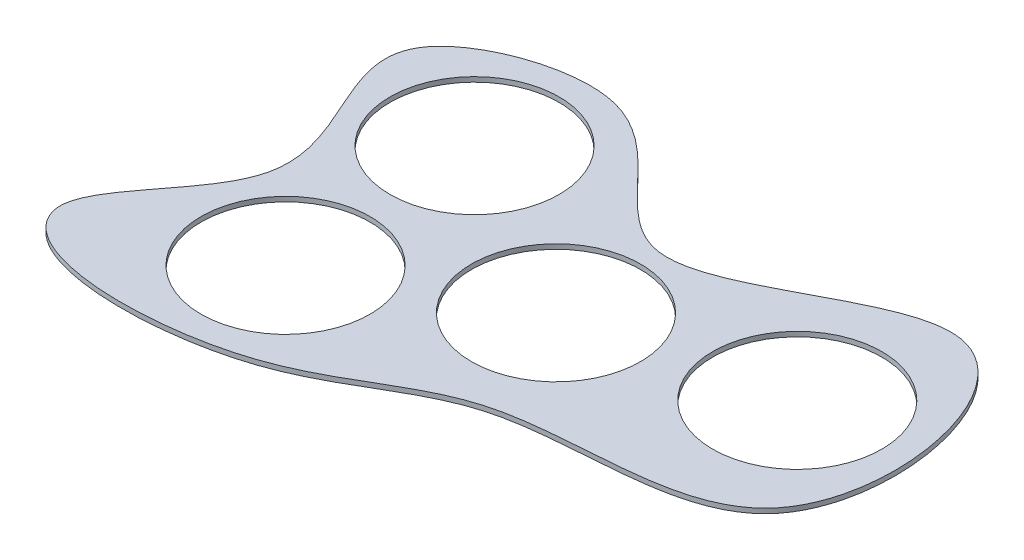
ISO-10303-21;
HEADER;
FILE_DESCRIPTION(('STEP AP214'),'2;1');
FILE_NAME('part.step','',(''),(''),'','','');
FILE_SCHEMA(('AUTOMOTIVE_DESIGN { 1 0 10303 214 1 1 1 1 }'));
ENDSEC;
DATA;
#1=APPLICATION_CONTEXT('core data for automotive mechanical design processes');
#2=APPLICATION_PROTOCOL_DEFINITION('international standard','automotive_design',2000,#1);
#3=PRODUCT_CONTEXT('',#1,'mechanical');
#4=PRODUCT('Part','Part','',(#3));
#5=PRODUCT_RELATED_PRODUCT_CATEGORY('part','',(#4));
#6=PRODUCT_DEFINITION_FORMATION('','',#4);
#7=PRODUCT_DEFINITION_CONTEXT('part definition',#1,'design');
#8=PRODUCT_DEFINITION('design','',#6,#7);
#9=PRODUCT_DEFINITION_SHAPE('','',#8);
#10=(LENGTH_UNIT() NAMED_UNIT(*) SI_UNIT(.MILLI.,.METRE.));
#11=(NAMED_UNIT(*) PLANE_ANGLE_UNIT() SI_UNIT($,.RADIAN.));
#12=(NAMED_UNIT(*) SI_UNIT($,.STERADIAN.) SOLID_ANGLE_UNIT());
#13=UNCERTAINTY_MEASURE_WITH_UNIT(LENGTH_MEASURE(1.E-05),#10,'distance_accuracy_value','');
#14=(GEOMETRIC_REPRESENTATION_CONTEXT(3) GLOBAL_UNCERTAINTY_ASSIGNED_CONTEXT((#13)) GLOBAL_UNIT_ASSIGNED_CONTEXT((#10,
#11,#12)) REPRESENTATION_CONTEXT('',''));
#15=CARTESIAN_POINT('',(0.,0.,0.));
#16=DIRECTION('',(0.,0.,1.));
#17=DIRECTION('',(1.,0.,0.));
#18=AXIS2_PLACEMENT_3D('',#15,#16,#17);
#19=CARTESIAN_POINT('',(376.308298772979,3.175,-277.585767369261));
#20=DIRECTION('',(0.,1.,0.));
#21=DIRECTION('',(0.,0.,1.));
#22=AXIS2_PLACEMENT_3D('',#19,#20,#21);
#23=PLANE('',#22);
#24=CARTESIAN_POINT('',(108.537567991192,3.175,-97.0398034103113));
#25=DIRECTION('',(0.,1.,0.));
#26=DIRECTION('',(0.,0.,1.));
#27=AXIS2_PLACEMENT_3D('',#24,#25,#26);
#28=CIRCLE('',#27,55.88);
#29=CARTESIAN_POINT('',(108.537567991192,3.175,-41.1598034103113));
#30=VERTEX_POINT('',#29);
#31=EDGE_CURVE('E63',#30,#30,#28,.T.);
#32=ORIENTED_EDGE('',*,*,#31,.F.);
#33=EDGE_LOOP('',(#32));
#34=FACE_BOUND('',#33,.T.);
#35=CARTESIAN_POINT('',(102.486134684682,3.175,-227.958678444939));
#36=DIRECTION('',(0.,1.,0.));
#37=DIRECTION('',(0.,0.,1.));
#38=AXIS2_PLACEMENT_3D('',#35,#36,#37);
#39=CIRCLE('',#38,55.88);
#40=CARTESIAN_POINT('',(102.486134684682,3.175,-172.078678444939));
#41=VERTEX_POINT('',#40);
#42=EDGE_CURVE('E46',#41,#41,#39,.T.);
#43=ORIENTED_EDGE('',*,*,#42,.F.);
#44=EDGE_LOOP('',(#43));
#45=FACE_BOUND('',#44,.T.);
#46=CARTESIAN_POINT('',(0.,3.175,-56.6444709200918));
#47=CARTESIAN_POINT('',(0.0126566039944185,3.175,-52.7630468766074));
#48=CARTESIAN_POINT('',(10.9143487990168,3.175,-15.8724778771619));
#49=CARTESIAN_POINT('',(163.766720812988,3.175,-15.8407560526298));
#50=CARTESIAN_POINT('',(250.715074531987,3.175,-106.079695571234));
#51=CARTESIAN_POINT('',(462.64127847462,3.175,-68.1597945949002));
#52=CARTESIAN_POINT('',(409.016180274923,3.175,-359.180610617191));
#53=CARTESIAN_POINT('',(209.806238473112,3.175,-169.252495944739));
#54=CARTESIAN_POINT('',(153.72950032436,3.175,-329.972611971777));
#55=CARTESIAN_POINT('',(-29.0455630594548,3.175,-261.573495278705));
#56=CARTESIAN_POINT('',(99.4877551865543,3.175,-156.747058417687));
#57=CARTESIAN_POINT('',(-0.0778541964517009,3.175,-80.5201606491206));
#58=CARTESIAN_POINT('',(0.,3.175,-56.6444709200918));
#59=B_SPLINE_CURVE_WITH_KNOTS('',3,(#46,#47,#48,#49,#50,#51,#52,#53,#54,#55,#56,#57,#58),
.UNSPECIFIED.,.T.,.F.,(4,1,1,1,1,1,1,1,1,1,4),(0.,0.0132885350104652,0.132885350104652,
0.229370198323285,0.35653493227593,0.505081347888579,0.620871775024687,0.725448929490409,
0.800000292431165,0.918258624847806,1.),.UNSPECIFIED.);
#60=CARTESIAN_POINT('',(0.,3.175,-56.6444709200918));
#61=VERTEX_POINT('',#60);
#62=EDGE_CURVE('E10',#61,#61,#59,.T.);
#63=ORIENTED_EDGE('',*,*,#62,.T.);
#64=EDGE_LOOP('',(#63));
#65=FACE_BOUND('',#64,.T.);
#66=CARTESIAN_POINT('',(225.036303489623,3.175,-159.227707713015));
#67=DIRECTION('',(0.,1.,0.));
#68=DIRECTION('',(0.,0.,1.));
#69=AXIS2_PLACEMENT_3D('',#66,#67,#68);
#70=CIRCLE('',#69,55.88);
#71=CARTESIAN_POINT('',(225.036303489623,3.175,-103.347707713015));
#72=VERTEX_POINT('',#71);
#73=EDGE_CURVE('E57',#72,#72,#70,.T.);
#74=ORIENTED_EDGE('',*,*,#73,.F.);
#75=EDGE_LOOP('',(#74));
#76=FACE_BOUND('',#75,.T.);
#77=CARTESIAN_POINT('',(354.832588956363,3.175,-188.836057118934));
#78=DIRECTION('',(0.,1.,0.));
#79=DIRECTION('',(0.,0.,1.));
#80=AXIS2_PLACEMENT_3D('',#77,#78,#79);
#81=CIRCLE('',#80,55.88);
#82=CARTESIAN_POINT('',(354.832588956363,3.175,-132.956057118934));
#83=VERTEX_POINT('',#82);
#84=EDGE_CURVE('E69',#83,#83,#81,.T.);
#85=ORIENTED_EDGE('',*,*,#84,.F.);
#86=EDGE_LOOP('',(#85));
#87=FACE_BOUND('',#86,.T.);
#88=ADVANCED_FACE('F33',(#34,#45,#65,#76,#87),#23,.T.);
#89=CARTESIAN_POINT('',(376.308298772979,0.,-277.585767369261));
#90=DIRECTION('',(0.,1.,0.));
#91=DIRECTION('',(0.,0.,1.));
#92=AXIS2_PLACEMENT_3D('',#89,#90,#91);
#93=PLANE('',#92);
#94=CARTESIAN_POINT('',(108.537567991192,0.,-97.0398034103113));
#95=DIRECTION('',(0.,1.,0.));
#96=DIRECTION('',(0.,0.,1.));
#97=AXIS2_PLACEMENT_3D('',#94,#95,#96);
#98=CIRCLE('',#97,55.88);
#99=CARTESIAN_POINT('',(108.537567991192,0.,-41.1598034103113));
#100=VERTEX_POINT('',#99);
#101=EDGE_CURVE('E66',#100,#100,#98,.T.);
#102=ORIENTED_EDGE('',*,*,#101,.T.);
#103=EDGE_LOOP('',(#102));
#104=FACE_BOUND('',#103,.T.);
#105=CARTESIAN_POINT('',(102.486134684682,0.,-227.958678444939));
#106=DIRECTION('',(0.,1.,0.));
#107=DIRECTION('',(0.,0.,1.));
#108=AXIS2_PLACEMENT_3D('',#105,#106,#107);
#109=CIRCLE('',#108,55.88);
#110=CARTESIAN_POINT('',(102.486134684682,0.,-172.078678444939));
#111=VERTEX_POINT('',#110);
#112=EDGE_CURVE('E51',#111,#111,#109,.T.);
#113=ORIENTED_EDGE('',*,*,#112,.T.);
#114=EDGE_LOOP('',(#113));
#115=FACE_BOUND('',#114,.T.);
#116=CARTESIAN_POINT('',(0.,0.,-56.6444709200918));
#117=CARTESIAN_POINT('',(0.0126566039944185,0.,-52.7630468766074));
#118=CARTESIAN_POINT('',(10.9143487990168,0.,-15.8724778771619));
#119=CARTESIAN_POINT('',(163.766720812988,0.,-15.8407560526298));
#120=CARTESIAN_POINT('',(250.715074531987,0.,-106.079695571234));
#121=CARTESIAN_POINT('',(462.64127847462,0.,-68.1597945949002));
#122=CARTESIAN_POINT('',(409.016180274923,0.,-359.180610617191));
#123=CARTESIAN_POINT('',(209.806238473112,0.,-169.252495944739));
#124=CARTESIAN_POINT('',(153.72950032436,0.,-329.972611971777));
#125=CARTESIAN_POINT('',(-29.0455630594548,0.,-261.573495278705));
#126=CARTESIAN_POINT('',(99.4877551865543,0.,-156.747058417687));
#127=CARTESIAN_POINT('',(-0.0778541964517009,0.,-80.5201606491206));
#128=CARTESIAN_POINT('',(0.,0.,-56.6444709200918));
#129=B_SPLINE_CURVE_WITH_KNOTS('',3,(#116,#117,#118,#119,#120,#121,#122,#123,#124,#125,#126,
#127,#128),.UNSPECIFIED.,.T.,.F.,(4,1,1,1,1,1,1,1,1,1,4),(0.,0.0132885350104652,
0.132885350104652,0.229370198323285,0.35653493227593,0.505081347888579,0.620871775024687,
0.725448929490409,0.800000292431165,0.918258624847806,1.),.UNSPECIFIED.);
#130=CARTESIAN_POINT('',(0.,0.,-56.6444709200918));
#131=VERTEX_POINT('',#130);
#132=EDGE_CURVE('E38',#131,#131,#129,.T.);
#133=ORIENTED_EDGE('',*,*,#132,.F.);
#134=EDGE_LOOP('',(#133));
#135=FACE_BOUND('',#134,.T.);
#136=CARTESIAN_POINT('',(225.036303489623,0.,-159.227707713015));
#137=DIRECTION('',(0.,1.,0.));
#138=DIRECTION('',(0.,0.,1.));
#139=AXIS2_PLACEMENT_3D('',#136,#137,#138);
#140=CIRCLE('',#139,55.88);
#141=CARTESIAN_POINT('',(225.036303489623,0.,-103.347707713015));
#142=VERTEX_POINT('',#141);
#143=EDGE_CURVE('E60',#142,#142,#140,.T.);
#144=ORIENTED_EDGE('',*,*,#143,.T.);
#145=EDGE_LOOP('',(#144));
#146=FACE_BOUND('',#145,.T.);
#147=CARTESIAN_POINT('',(354.832588956363,0.,-188.836057118934));
#148=DIRECTION('',(0.,1.,0.));
#149=DIRECTION('',(0.,0.,1.));
#150=AXIS2_PLACEMENT_3D('',#147,#148,#149);
#151=CIRCLE('',#150,55.88);
#152=CARTESIAN_POINT('',(354.832588956363,0.,-132.956057118934));
#153=VERTEX_POINT('',#152);
#154=EDGE_CURVE('E72',#153,#153,#151,.T.);
#155=ORIENTED_EDGE('',*,*,#154,.T.);
#156=EDGE_LOOP('',(#155));
#157=FACE_BOUND('',#156,.T.);
#158=ADVANCED_FACE('F82',(#104,#115,#135,#146,#157),#93,.F.);
#159=DIRECTION('',(0.,-1.,0.));
#160=VECTOR('',#159,1.);
#161=SURFACE_OF_LINEAR_EXTRUSION('',#59,#160);
#162=ORIENTED_EDGE('',*,*,#62,.F.);
#163=EDGE_LOOP('',(#162));
#164=FACE_BOUND('',#163,.T.);
#165=ORIENTED_EDGE('',*,*,#132,.T.);
#166=EDGE_LOOP('',(#165));
#167=FACE_BOUND('',#166,.T.);
#168=ADVANCED_FACE('F35',(#164,#167),#161,.F.);
#169=CARTESIAN_POINT('',(102.486134684682,3.175,-227.958678444939));
#170=DIRECTION('',(0.,-1.,0.));
#171=DIRECTION('',(0.,0.,-1.));
#172=AXIS2_PLACEMENT_3D('',#169,#170,#171);
#173=CYLINDRICAL_SURFACE('',#172,55.88);
#174=ORIENTED_EDGE('',*,*,#42,.T.);
#175=EDGE_LOOP('',(#174));
#176=FACE_BOUND('',#175,.T.);
#177=ORIENTED_EDGE('',*,*,#112,.F.);
#178=EDGE_LOOP('',(#177));
#179=FACE_BOUND('',#178,.T.);
#180=ADVANCED_FACE('F92',(#176,#179),#173,.F.);
#181=CARTESIAN_POINT('',(225.036303489623,3.175,-159.227707713015));
#182=DIRECTION('',(0.,-1.,0.));
#183=DIRECTION('',(0.,0.,-1.));
#184=AXIS2_PLACEMENT_3D('',#181,#182,#183);
#185=CYLINDRICAL_SURFACE('',#184,55.88);
#186=ORIENTED_EDGE('',*,*,#73,.T.);
#187=EDGE_LOOP('',(#186));
#188=FACE_BOUND('',#187,.T.);
#189=ORIENTED_EDGE('',*,*,#143,.F.);
#190=EDGE_LOOP('',(#189));
#191=FACE_BOUND('',#190,.T.);
#192=ADVANCED_FACE('F95',(#188,#191),#185,.F.);
#193=CARTESIAN_POINT('',(108.537567991192,3.175,-97.0398034103113));
#194=DIRECTION('',(0.,-1.,0.));
#195=DIRECTION('',(0.,0.,-1.));
#196=AXIS2_PLACEMENT_3D('',#193,#194,#195);
#197=CYLINDRICAL_SURFACE('',#196,55.88);
#198=ORIENTED_EDGE('',*,*,#31,.T.);
#199=EDGE_LOOP('',(#198));
#200=FACE_BOUND('',#199,.T.);
#201=ORIENTED_EDGE('',*,*,#101,.F.);
#202=EDGE_LOOP('',(#201));
#203=FACE_BOUND('',#202,.T.);
#204=ADVANCED_FACE('F99',(#200,#203),#197,.F.);
#205=CARTESIAN_POINT('',(354.832588956363,3.175,-188.836057118934));
#206=DIRECTION('',(0.,-1.,0.));
#207=DIRECTION('',(0.,0.,-1.));
#208=AXIS2_PLACEMENT_3D('',#205,#206,#207);
#209=CYLINDRICAL_SURFACE('',#208,55.88);
#210=ORIENTED_EDGE('',*,*,#84,.T.);
#211=EDGE_LOOP('',(#210));
#212=FACE_BOUND('',#211,.T.);
#213=ORIENTED_EDGE('',*,*,#154,.F.);
#214=EDGE_LOOP('',(#213));
#215=FACE_BOUND('',#214,.T.);
#216=ADVANCED_FACE('F78',(#212,#215),#209,.F.);
#217=CLOSED_SHELL('',(#88,#158,#168,#180,#192,#204,#216));
#218=MANIFOLD_SOLID_BREP('B2',#217);
#219=ADVANCED_BREP_SHAPE_REPRESENTATION('',(#18,#218),#14);
#220=SHAPE_DEFINITION_REPRESENTATION(#9,#219);
ENDSEC;
END-ISO-10303-21;
